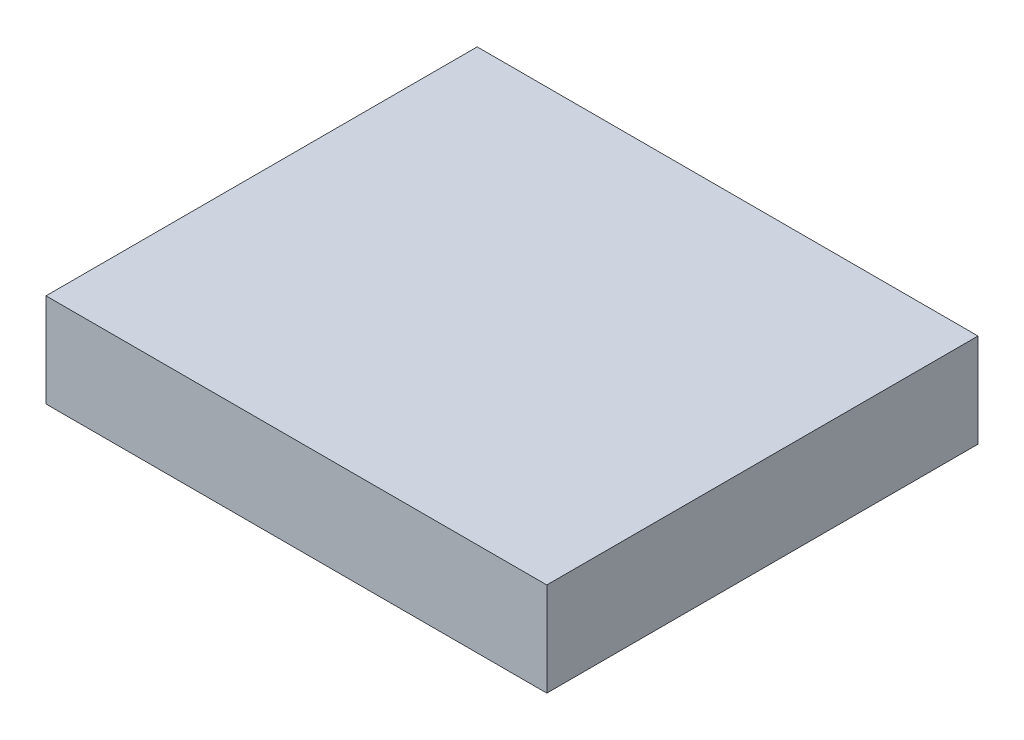
ISO-10303-21;
HEADER;
FILE_DESCRIPTION(('STEP AP214'),'2;1');
FILE_NAME('part.step','',(''),(''),'','','');
FILE_SCHEMA(('AUTOMOTIVE_DESIGN { 1 0 10303 214 1 1 1 1 }'));
ENDSEC;
DATA;
#1=APPLICATION_CONTEXT('core data for automotive mechanical design processes');
#2=APPLICATION_PROTOCOL_DEFINITION('international standard','automotive_design',2000,#1);
#3=PRODUCT_CONTEXT('',#1,'mechanical');
#4=PRODUCT('Part','Part','',(#3));
#5=PRODUCT_RELATED_PRODUCT_CATEGORY('part','',(#4));
#6=PRODUCT_DEFINITION_FORMATION('','',#4);
#7=PRODUCT_DEFINITION_CONTEXT('part definition',#1,'design');
#8=PRODUCT_DEFINITION('design','',#6,#7);
#9=PRODUCT_DEFINITION_SHAPE('','',#8);
#10=(LENGTH_UNIT() NAMED_UNIT(*) SI_UNIT(.MILLI.,.METRE.));
#11=(NAMED_UNIT(*) PLANE_ANGLE_UNIT() SI_UNIT($,.RADIAN.));
#12=(NAMED_UNIT(*) SI_UNIT($,.STERADIAN.) SOLID_ANGLE_UNIT());
#13=UNCERTAINTY_MEASURE_WITH_UNIT(LENGTH_MEASURE(1.E-05),#10,'distance_accuracy_value','');
#14=(GEOMETRIC_REPRESENTATION_CONTEXT(3) GLOBAL_UNCERTAINTY_ASSIGNED_CONTEXT((#13)) GLOBAL_UNIT_ASSIGNED_CONTEXT((#10,
#11,#12)) REPRESENTATION_CONTEXT('',''));
#15=CARTESIAN_POINT('',(0.,0.,0.));
#16=DIRECTION('',(0.,0.,1.));
#17=DIRECTION('',(1.,0.,0.));
#18=AXIS2_PLACEMENT_3D('',#15,#16,#17);
#19=CARTESIAN_POINT('',(-26.315170054864,6.093205362914,0.));
#20=DIRECTION('',(-1.,0.,0.));
#21=DIRECTION('',(0.,-1.,0.));
#22=AXIS2_PLACEMENT_3D('',#19,#20,#21);
#23=PLANE('',#22);
#24=DIRECTION('',(0.,-1.,0.));
#25=VECTOR('',#24,1.);
#26=CARTESIAN_POINT('',(-26.315170054864,6.093205362914,0.));
#27=LINE('',#26,#25);
#28=CARTESIAN_POINT('',(-26.315170054864,6.093205362914,0.));
#29=VERTEX_POINT('',#28);
#30=CARTESIAN_POINT('',(-26.315170054864,6.071476226117,0.));
#31=VERTEX_POINT('',#30);
#32=EDGE_CURVE('E11',#29,#31,#27,.T.);
#33=ORIENTED_EDGE('',*,*,#32,.T.);
#34=DIRECTION('',(0.,0.,1.));
#35=VECTOR('',#34,1.);
#36=CARTESIAN_POINT('',(-26.315170054864,6.071476226117,0.));
#37=LINE('',#36,#35);
#38=CARTESIAN_POINT('',(-26.315170054864,6.071476226117,0.1));
#39=VERTEX_POINT('',#38);
#40=EDGE_CURVE('E24',#31,#39,#37,.T.);
#41=ORIENTED_EDGE('',*,*,#40,.T.);
#42=DIRECTION('',(0.,-1.,0.));
#43=VECTOR('',#42,1.);
#44=CARTESIAN_POINT('',(-26.315170054864,6.093205362914,0.1));
#45=LINE('',#44,#43);
#46=CARTESIAN_POINT('',(-26.315170054864,6.093205362914,0.1));
#47=VERTEX_POINT('',#46);
#48=EDGE_CURVE('E75',#47,#39,#45,.T.);
#49=ORIENTED_EDGE('',*,*,#48,.F.);
#50=DIRECTION('',(0.,0.,1.));
#51=VECTOR('',#50,1.);
#52=CARTESIAN_POINT('',(-26.315170054864,6.093205362914,0.));
#53=LINE('',#52,#51);
#54=EDGE_CURVE('E86',#29,#47,#53,.T.);
#55=ORIENTED_EDGE('',*,*,#54,.F.);
#56=EDGE_LOOP('',(#33,#41,#49,#55));
#57=FACE_BOUND('',#56,.T.);
#58=ADVANCED_FACE('F17',(#57),#23,.T.);
#59=CARTESIAN_POINT('',(-26.199029290648,6.093205362914,0.));
#60=DIRECTION('',(0.,1.,0.));
#61=DIRECTION('',(-1.,0.,0.));
#62=AXIS2_PLACEMENT_3D('',#59,#60,#61);
#63=PLANE('',#62);
#64=DIRECTION('',(-1.,0.,0.));
#65=VECTOR('',#64,1.);
#66=CARTESIAN_POINT('',(-26.199029290648,6.093205362914,0.));
#67=LINE('',#66,#65);
#68=CARTESIAN_POINT('',(-26.199029290648,6.093205362914,0.));
#69=VERTEX_POINT('',#68);
#70=EDGE_CURVE('E83',#69,#29,#67,.T.);
#71=ORIENTED_EDGE('',*,*,#70,.T.);
#72=ORIENTED_EDGE('',*,*,#54,.T.);
#73=DIRECTION('',(-1.,0.,0.));
#74=VECTOR('',#73,1.);
#75=CARTESIAN_POINT('',(-26.199029290648,6.093205362914,0.1));
#76=LINE('',#75,#74);
#77=CARTESIAN_POINT('',(-26.199029290648,6.093205362914,0.1));
#78=VERTEX_POINT('',#77);
#79=EDGE_CURVE('E81',#78,#47,#76,.T.);
#80=ORIENTED_EDGE('',*,*,#79,.F.);
#81=DIRECTION('',(0.,0.,1.));
#82=VECTOR('',#81,1.);
#83=CARTESIAN_POINT('',(-26.199029290648,6.093205362914,0.));
#84=LINE('',#83,#82);
#85=EDGE_CURVE('E61',#69,#78,#84,.T.);
#86=ORIENTED_EDGE('',*,*,#85,.F.);
#87=EDGE_LOOP('',(#71,#72,#80,#86));
#88=FACE_BOUND('',#87,.T.);
#89=ADVANCED_FACE('F91',(#88),#63,.T.);
#90=CARTESIAN_POINT('',(-26.199029290648,6.071476226117,0.));
#91=DIRECTION('',(1.,0.,0.));
#92=DIRECTION('',(0.,1.,0.));
#93=AXIS2_PLACEMENT_3D('',#90,#91,#92);
#94=PLANE('',#93);
#95=DIRECTION('',(0.,1.,0.));
#96=VECTOR('',#95,1.);
#97=CARTESIAN_POINT('',(-26.199029290648,6.071476226117,0.));
#98=LINE('',#97,#96);
#99=CARTESIAN_POINT('',(-26.199029290648,6.071476226117,0.));
#100=VERTEX_POINT('',#99);
#101=EDGE_CURVE('E65',#100,#69,#98,.T.);
#102=ORIENTED_EDGE('',*,*,#101,.T.);
#103=ORIENTED_EDGE('',*,*,#85,.T.);
#104=DIRECTION('',(0.,1.,0.));
#105=VECTOR('',#104,1.);
#106=CARTESIAN_POINT('',(-26.199029290648,6.071476226117,0.1));
#107=LINE('',#106,#105);
#108=CARTESIAN_POINT('',(-26.199029290648,6.071476226117,0.1));
#109=VERTEX_POINT('',#108);
#110=EDGE_CURVE('E54',#109,#78,#107,.T.);
#111=ORIENTED_EDGE('',*,*,#110,.F.);
#112=DIRECTION('',(0.,0.,1.));
#113=VECTOR('',#112,1.);
#114=CARTESIAN_POINT('',(-26.199029290648,6.071476226117,0.));
#115=LINE('',#114,#113);
#116=EDGE_CURVE('E58',#100,#109,#115,.T.);
#117=ORIENTED_EDGE('',*,*,#116,.F.);
#118=EDGE_LOOP('',(#102,#103,#111,#117));
#119=FACE_BOUND('',#118,.T.);
#120=ADVANCED_FACE('F57',(#119),#94,.T.);
#121=CARTESIAN_POINT('',(-26.315170054864,6.071476226117,0.));
#122=DIRECTION('',(0.,-1.,0.));
#123=DIRECTION('',(1.,0.,0.));
#124=AXIS2_PLACEMENT_3D('',#121,#122,#123);
#125=PLANE('',#124);
#126=DIRECTION('',(1.,0.,0.));
#127=VECTOR('',#126,1.);
#128=CARTESIAN_POINT('',(-26.315170054864,6.071476226117,0.));
#129=LINE('',#128,#127);
#130=EDGE_CURVE('E71',#31,#100,#129,.T.);
#131=ORIENTED_EDGE('',*,*,#130,.T.);
#132=ORIENTED_EDGE('',*,*,#116,.T.);
#133=DIRECTION('',(1.,0.,0.));
#134=VECTOR('',#133,1.);
#135=CARTESIAN_POINT('',(-26.315170054864,6.071476226117,0.1));
#136=LINE('',#135,#134);
#137=EDGE_CURVE('E70',#39,#109,#136,.T.);
#138=ORIENTED_EDGE('',*,*,#137,.F.);
#139=ORIENTED_EDGE('',*,*,#40,.F.);
#140=EDGE_LOOP('',(#131,#132,#138,#139));
#141=FACE_BOUND('',#140,.T.);
#142=ADVANCED_FACE('F69',(#141),#125,.T.);
#143=CARTESIAN_POINT('',(-26.257099672756,6.082340794515,0.1));
#144=DIRECTION('',(0.,0.,1.));
#145=DIRECTION('',(1.,0.,0.));
#146=AXIS2_PLACEMENT_3D('',#143,#144,#145);
#147=PLANE('',#146);
#148=ORIENTED_EDGE('',*,*,#137,.T.);
#149=ORIENTED_EDGE('',*,*,#110,.T.);
#150=ORIENTED_EDGE('',*,*,#79,.T.);
#151=ORIENTED_EDGE('',*,*,#48,.T.);
#152=EDGE_LOOP('',(#148,#149,#150,#151));
#153=FACE_BOUND('',#152,.T.);
#154=ADVANCED_FACE('F74',(#153),#147,.T.);
#155=CARTESIAN_POINT('',(-26.257099672756,6.082340794515,0.));
#156=DIRECTION('',(0.,0.,1.));
#157=DIRECTION('',(1.,0.,0.));
#158=AXIS2_PLACEMENT_3D('',#155,#156,#157);
#159=PLANE('',#158);
#160=ORIENTED_EDGE('',*,*,#130,.F.);
#161=ORIENTED_EDGE('',*,*,#32,.F.);
#162=ORIENTED_EDGE('',*,*,#70,.F.);
#163=ORIENTED_EDGE('',*,*,#101,.F.);
#164=EDGE_LOOP('',(#160,#161,#162,#163));
#165=FACE_BOUND('',#164,.T.);
#166=ADVANCED_FACE('F89',(#165),#159,.F.);
#167=CLOSED_SHELL('',(#58,#89,#120,#142,#154,#166));
#168=MANIFOLD_SOLID_BREP('B1',#167);
#169=ADVANCED_BREP_SHAPE_REPRESENTATION('',(#18,#168),#14);
#170=SHAPE_DEFINITION_REPRESENTATION(#9,#169);
ENDSEC;
END-ISO-10303-21;
